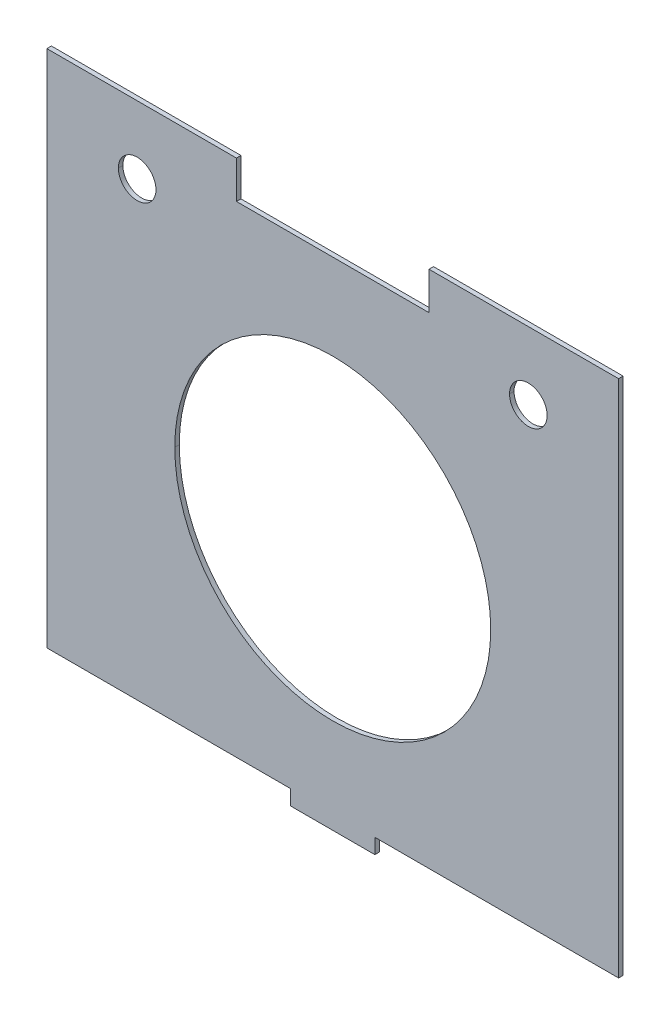
ISO-10303-21;
HEADER;
FILE_DESCRIPTION(('STEP AP214'),'2;1');
FILE_NAME('part.step','',(''),(''),'','','');
FILE_SCHEMA(('AUTOMOTIVE_DESIGN { 1 0 10303 214 1 1 1 1 }'));
ENDSEC;
DATA;
#1=APPLICATION_CONTEXT('core data for automotive mechanical design processes');
#2=APPLICATION_PROTOCOL_DEFINITION('international standard','automotive_design',2000,#1);
#3=PRODUCT_CONTEXT('',#1,'mechanical');
#4=PRODUCT('Part','Part','',(#3));
#5=PRODUCT_RELATED_PRODUCT_CATEGORY('part','',(#4));
#6=PRODUCT_DEFINITION_FORMATION('','',#4);
#7=PRODUCT_DEFINITION_CONTEXT('part definition',#1,'design');
#8=PRODUCT_DEFINITION('design','',#6,#7);
#9=PRODUCT_DEFINITION_SHAPE('','',#8);
#10=(LENGTH_UNIT() NAMED_UNIT(*) SI_UNIT(.MILLI.,.METRE.));
#11=(NAMED_UNIT(*) PLANE_ANGLE_UNIT() SI_UNIT($,.RADIAN.));
#12=(NAMED_UNIT(*) SI_UNIT($,.STERADIAN.) SOLID_ANGLE_UNIT());
#13=UNCERTAINTY_MEASURE_WITH_UNIT(LENGTH_MEASURE(1.E-05),#10,'distance_accuracy_value','');
#14=(GEOMETRIC_REPRESENTATION_CONTEXT(3) GLOBAL_UNCERTAINTY_ASSIGNED_CONTEXT((#13)) GLOBAL_UNIT_ASSIGNED_CONTEXT((#10,
#11,#12)) REPRESENTATION_CONTEXT('',''));
#15=CARTESIAN_POINT('',(0.,0.,0.));
#16=DIRECTION('',(0.,0.,1.));
#17=DIRECTION('',(1.,0.,0.));
#18=AXIS2_PLACEMENT_3D('',#15,#16,#17);
#19=CARTESIAN_POINT('',(-13.,14.2,0.3));
#20=DIRECTION('',(0.,0.,1.));
#21=DIRECTION('',(-1.,0.,0.));
#22=AXIS2_PLACEMENT_3D('',#19,#20,#21);
#23=CYLINDRICAL_SURFACE('',#22,1.25);
#24=DIRECTION('',(0.,0.,-1.));
#25=VECTOR('',#24,1.);
#26=CARTESIAN_POINT('',(-11.75,14.2,0.3));
#27=LINE('',#26,#25);
#28=CARTESIAN_POINT('',(-11.75,14.2,0.3));
#29=VERTEX_POINT('',#28);
#30=CARTESIAN_POINT('',(-11.75,14.2,0.));
#31=VERTEX_POINT('',#30);
#32=EDGE_CURVE('E11',#29,#31,#27,.T.);
#33=ORIENTED_EDGE('',*,*,#32,.F.);
#34=CARTESIAN_POINT('',(-13.,14.2,0.3));
#35=DIRECTION('',(0.,0.,1.));
#36=DIRECTION('',(1.,0.,0.));
#37=AXIS2_PLACEMENT_3D('',#34,#35,#36);
#38=CIRCLE('',#37,1.25);
#39=CARTESIAN_POINT('',(-14.25,14.2,0.3));
#40=VERTEX_POINT('',#39);
#41=EDGE_CURVE('E262',#29,#40,#38,.T.);
#42=ORIENTED_EDGE('',*,*,#41,.T.);
#43=DIRECTION('',(0.,0.,-1.));
#44=VECTOR('',#43,1.);
#45=CARTESIAN_POINT('',(-14.25,14.2,0.3));
#46=LINE('',#45,#44);
#47=CARTESIAN_POINT('',(-14.25,14.2,0.));
#48=VERTEX_POINT('',#47);
#49=EDGE_CURVE('E20',#40,#48,#46,.T.);
#50=ORIENTED_EDGE('',*,*,#49,.T.);
#51=CARTESIAN_POINT('',(-13.,14.2,0.));
#52=DIRECTION('',(0.,0.,1.));
#53=DIRECTION('',(1.,0.,0.));
#54=AXIS2_PLACEMENT_3D('',#51,#52,#53);
#55=CIRCLE('',#54,1.25);
#56=EDGE_CURVE('E242',#31,#48,#55,.T.);
#57=ORIENTED_EDGE('',*,*,#56,.F.);
#58=EDGE_LOOP('',(#33,#42,#50,#57));
#59=FACE_BOUND('',#58,.T.);
#60=ADVANCED_FACE('F17',(#59),#23,.F.);
#61=CARTESIAN_POINT('',(-13.,14.2,0.3));
#62=DIRECTION('',(0.,0.,1.));
#63=DIRECTION('',(-1.,0.,0.));
#64=AXIS2_PLACEMENT_3D('',#61,#62,#63);
#65=CYLINDRICAL_SURFACE('',#64,1.25);
#66=ORIENTED_EDGE('',*,*,#49,.F.);
#67=CARTESIAN_POINT('',(-13.,14.2,0.3));
#68=DIRECTION('',(0.,0.,1.));
#69=DIRECTION('',(-1.,0.,0.));
#70=AXIS2_PLACEMENT_3D('',#67,#68,#69);
#71=CIRCLE('',#70,1.25);
#72=EDGE_CURVE('E265',#40,#29,#71,.T.);
#73=ORIENTED_EDGE('',*,*,#72,.T.);
#74=ORIENTED_EDGE('',*,*,#32,.T.);
#75=CARTESIAN_POINT('',(-13.,14.2,0.));
#76=DIRECTION('',(0.,0.,1.));
#77=DIRECTION('',(-1.,0.,0.));
#78=AXIS2_PLACEMENT_3D('',#75,#76,#77);
#79=CIRCLE('',#78,1.25);
#80=EDGE_CURVE('E248',#48,#31,#79,.T.);
#81=ORIENTED_EDGE('',*,*,#80,.F.);
#82=EDGE_LOOP('',(#66,#73,#74,#81));
#83=FACE_BOUND('',#82,.T.);
#84=ADVANCED_FACE('F352',(#83),#65,.F.);
#85=CARTESIAN_POINT('',(13.,14.2,0.3));
#86=DIRECTION('',(0.,0.,1.));
#87=DIRECTION('',(-1.,0.,0.));
#88=AXIS2_PLACEMENT_3D('',#85,#86,#87);
#89=CYLINDRICAL_SURFACE('',#88,1.25);
#90=DIRECTION('',(0.,0.,-1.));
#91=VECTOR('',#90,1.);
#92=CARTESIAN_POINT('',(14.25,14.2,0.3));
#93=LINE('',#92,#91);
#94=CARTESIAN_POINT('',(14.25,14.2,0.3));
#95=VERTEX_POINT('',#94);
#96=CARTESIAN_POINT('',(14.25,14.2,0.));
#97=VERTEX_POINT('',#96);
#98=EDGE_CURVE('E343',#95,#97,#93,.T.);
#99=ORIENTED_EDGE('',*,*,#98,.F.);
#100=CARTESIAN_POINT('',(13.,14.2,0.3));
#101=DIRECTION('',(0.,0.,1.));
#102=DIRECTION('',(1.,0.,0.));
#103=AXIS2_PLACEMENT_3D('',#100,#101,#102);
#104=CIRCLE('',#103,1.25);
#105=CARTESIAN_POINT('',(11.75,14.2,0.3));
#106=VERTEX_POINT('',#105);
#107=EDGE_CURVE('E315',#95,#106,#104,.T.);
#108=ORIENTED_EDGE('',*,*,#107,.T.);
#109=DIRECTION('',(0.,0.,-1.));
#110=VECTOR('',#109,1.);
#111=CARTESIAN_POINT('',(11.75,14.2,0.3));
#112=LINE('',#111,#110);
#113=CARTESIAN_POINT('',(11.75,14.2,0.));
#114=VERTEX_POINT('',#113);
#115=EDGE_CURVE('E286',#106,#114,#112,.T.);
#116=ORIENTED_EDGE('',*,*,#115,.T.);
#117=CARTESIAN_POINT('',(13.,14.2,0.));
#118=DIRECTION('',(0.,0.,1.));
#119=DIRECTION('',(1.,0.,0.));
#120=AXIS2_PLACEMENT_3D('',#117,#118,#119);
#121=CIRCLE('',#120,1.25);
#122=EDGE_CURVE('E243',#97,#114,#121,.T.);
#123=ORIENTED_EDGE('',*,*,#122,.F.);
#124=EDGE_LOOP('',(#99,#108,#116,#123));
#125=FACE_BOUND('',#124,.T.);
#126=ADVANCED_FACE('F456',(#125),#89,.F.);
#127=CARTESIAN_POINT('',(13.,14.2,0.3));
#128=DIRECTION('',(0.,0.,1.));
#129=DIRECTION('',(-1.,0.,0.));
#130=AXIS2_PLACEMENT_3D('',#127,#128,#129);
#131=CYLINDRICAL_SURFACE('',#130,1.25);
#132=ORIENTED_EDGE('',*,*,#115,.F.);
#133=CARTESIAN_POINT('',(13.,14.2,0.3));
#134=DIRECTION('',(0.,0.,1.));
#135=DIRECTION('',(-1.,0.,0.));
#136=AXIS2_PLACEMENT_3D('',#133,#134,#135);
#137=CIRCLE('',#136,1.25);
#138=EDGE_CURVE('E266',#106,#95,#137,.T.);
#139=ORIENTED_EDGE('',*,*,#138,.T.);
#140=ORIENTED_EDGE('',*,*,#98,.T.);
#141=CARTESIAN_POINT('',(13.,14.2,0.));
#142=DIRECTION('',(0.,0.,1.));
#143=DIRECTION('',(-1.,0.,0.));
#144=AXIS2_PLACEMENT_3D('',#141,#142,#143);
#145=CIRCLE('',#144,1.25);
#146=EDGE_CURVE('E239',#114,#97,#145,.T.);
#147=ORIENTED_EDGE('',*,*,#146,.F.);
#148=EDGE_LOOP('',(#132,#139,#140,#147));
#149=FACE_BOUND('',#148,.T.);
#150=ADVANCED_FACE('F447',(#149),#131,.F.);
#151=CARTESIAN_POINT('',(6.4,16.2,0.));
#152=DIRECTION('',(0.,1.,0.));
#153=DIRECTION('',(1.,0.,0.));
#154=AXIS2_PLACEMENT_3D('',#151,#152,#153);
#155=PLANE('',#154);
#156=DIRECTION('',(0.,0.,1.));
#157=VECTOR('',#156,1.);
#158=CARTESIAN_POINT('',(-6.4,16.2,0.));
#159=LINE('',#158,#157);
#160=CARTESIAN_POINT('',(-6.4,16.2,0.));
#161=VERTEX_POINT('',#160);
#162=CARTESIAN_POINT('',(-6.4,16.2,0.3));
#163=VERTEX_POINT('',#162);
#164=EDGE_CURVE('E283',#161,#163,#159,.T.);
#165=ORIENTED_EDGE('',*,*,#164,.T.);
#166=DIRECTION('',(-1.,0.,0.));
#167=VECTOR('',#166,1.);
#168=CARTESIAN_POINT('',(6.4,16.2,0.3));
#169=LINE('',#168,#167);
#170=CARTESIAN_POINT('',(6.4,16.2,0.3));
#171=VERTEX_POINT('',#170);
#172=EDGE_CURVE('E269',#171,#163,#169,.T.);
#173=ORIENTED_EDGE('',*,*,#172,.F.);
#174=DIRECTION('',(0.,0.,1.));
#175=VECTOR('',#174,1.);
#176=CARTESIAN_POINT('',(6.4,16.2,0.));
#177=LINE('',#176,#175);
#178=CARTESIAN_POINT('',(6.4,16.2,0.));
#179=VERTEX_POINT('',#178);
#180=EDGE_CURVE('E324',#179,#171,#177,.T.);
#181=ORIENTED_EDGE('',*,*,#180,.F.);
#182=DIRECTION('',(-1.,0.,0.));
#183=VECTOR('',#182,1.);
#184=CARTESIAN_POINT('',(6.4,16.2,0.));
#185=LINE('',#184,#183);
#186=EDGE_CURVE('E224',#179,#161,#185,.T.);
#187=ORIENTED_EDGE('',*,*,#186,.T.);
#188=EDGE_LOOP('',(#165,#173,#181,#187));
#189=FACE_BOUND('',#188,.T.);
#190=ADVANCED_FACE('F445',(#189),#155,.T.);
#191=CARTESIAN_POINT('',(-6.4,16.2,0.));
#192=DIRECTION('',(1.,0.,0.));
#193=DIRECTION('',(0.,1.,0.));
#194=AXIS2_PLACEMENT_3D('',#191,#192,#193);
#195=PLANE('',#194);
#196=DIRECTION('',(0.,0.,1.));
#197=VECTOR('',#196,1.);
#198=CARTESIAN_POINT('',(-6.4,18.7,0.));
#199=LINE('',#198,#197);
#200=CARTESIAN_POINT('',(-6.4,18.7,0.));
#201=VERTEX_POINT('',#200);
#202=CARTESIAN_POINT('',(-6.4,18.7,0.3));
#203=VERTEX_POINT('',#202);
#204=EDGE_CURVE('E287',#201,#203,#199,.T.);
#205=ORIENTED_EDGE('',*,*,#204,.T.);
#206=DIRECTION('',(0.,1.,0.));
#207=VECTOR('',#206,1.);
#208=CARTESIAN_POINT('',(-6.4,16.2,0.3));
#209=LINE('',#208,#207);
#210=EDGE_CURVE('E273',#163,#203,#209,.T.);
#211=ORIENTED_EDGE('',*,*,#210,.F.);
#212=ORIENTED_EDGE('',*,*,#164,.F.);
#213=DIRECTION('',(0.,1.,0.));
#214=VECTOR('',#213,1.);
#215=CARTESIAN_POINT('',(-6.4,16.2,0.));
#216=LINE('',#215,#214);
#217=EDGE_CURVE('E227',#161,#201,#216,.T.);
#218=ORIENTED_EDGE('',*,*,#217,.T.);
#219=EDGE_LOOP('',(#205,#211,#212,#218));
#220=FACE_BOUND('',#219,.T.);
#221=ADVANCED_FACE('F443',(#220),#195,.T.);
#222=CARTESIAN_POINT('',(-6.4,18.7,0.));
#223=DIRECTION('',(0.,1.,0.));
#224=DIRECTION('',(1.,0.,0.));
#225=AXIS2_PLACEMENT_3D('',#222,#223,#224);
#226=PLANE('',#225);
#227=DIRECTION('',(0.,0.,1.));
#228=VECTOR('',#227,1.);
#229=CARTESIAN_POINT('',(-19.,18.7,0.));
#230=LINE('',#229,#228);
#231=CARTESIAN_POINT('',(-19.,18.7,0.));
#232=VERTEX_POINT('',#231);
#233=CARTESIAN_POINT('',(-19.,18.7,0.3));
#234=VERTEX_POINT('',#233);
#235=EDGE_CURVE('E195',#232,#234,#230,.T.);
#236=ORIENTED_EDGE('',*,*,#235,.T.);
#237=DIRECTION('',(-1.,0.,0.));
#238=VECTOR('',#237,1.);
#239=CARTESIAN_POINT('',(-6.4,18.7,0.3));
#240=LINE('',#239,#238);
#241=EDGE_CURVE('E278',#203,#234,#240,.T.);
#242=ORIENTED_EDGE('',*,*,#241,.F.);
#243=ORIENTED_EDGE('',*,*,#204,.F.);
#244=DIRECTION('',(-1.,0.,0.));
#245=VECTOR('',#244,1.);
#246=CARTESIAN_POINT('',(-6.4,18.7,0.));
#247=LINE('',#246,#245);
#248=EDGE_CURVE('E205',#201,#232,#247,.T.);
#249=ORIENTED_EDGE('',*,*,#248,.T.);
#250=EDGE_LOOP('',(#236,#242,#243,#249));
#251=FACE_BOUND('',#250,.T.);
#252=ADVANCED_FACE('F441',(#251),#226,.T.);
#253=CARTESIAN_POINT('',(-19.,18.7,0.));
#254=DIRECTION('',(-1.,0.,0.));
#255=DIRECTION('',(0.,0.,1.));
#256=AXIS2_PLACEMENT_3D('',#253,#254,#255);
#257=PLANE('',#256);
#258=DIRECTION('',(0.,0.,1.));
#259=VECTOR('',#258,1.);
#260=CARTESIAN_POINT('',(-19.,-15.8,0.));
#261=LINE('',#260,#259);
#262=CARTESIAN_POINT('',(-19.,-15.8,0.));
#263=VERTEX_POINT('',#262);
#264=CARTESIAN_POINT('',(-19.,-15.8,0.3));
#265=VERTEX_POINT('',#264);
#266=EDGE_CURVE('E183',#263,#265,#261,.T.);
#267=ORIENTED_EDGE('',*,*,#266,.T.);
#268=DIRECTION('',(0.,-1.,0.));
#269=VECTOR('',#268,1.);
#270=CARTESIAN_POINT('',(-19.,18.7,0.3));
#271=LINE('',#270,#269);
#272=EDGE_CURVE('E282',#234,#265,#271,.T.);
#273=ORIENTED_EDGE('',*,*,#272,.F.);
#274=ORIENTED_EDGE('',*,*,#235,.F.);
#275=DIRECTION('',(0.,-1.,0.));
#276=VECTOR('',#275,1.);
#277=CARTESIAN_POINT('',(-19.,18.7,0.));
#278=LINE('',#277,#276);
#279=EDGE_CURVE('E199',#232,#263,#278,.T.);
#280=ORIENTED_EDGE('',*,*,#279,.T.);
#281=EDGE_LOOP('',(#267,#273,#274,#280));
#282=FACE_BOUND('',#281,.T.);
#283=ADVANCED_FACE('F200',(#282),#257,.T.);
#284=CARTESIAN_POINT('',(-19.,-15.8,0.));
#285=DIRECTION('',(0.,-1.,0.));
#286=DIRECTION('',(0.,0.,-1.));
#287=AXIS2_PLACEMENT_3D('',#284,#285,#286);
#288=PLANE('',#287);
#289=DIRECTION('',(0.,0.,1.));
#290=VECTOR('',#289,1.);
#291=CARTESIAN_POINT('',(-2.8,-15.8,0.));
#292=LINE('',#291,#290);
#293=CARTESIAN_POINT('',(-2.8,-15.8,0.));
#294=VERTEX_POINT('',#293);
#295=CARTESIAN_POINT('',(-2.8,-15.8,0.3));
#296=VERTEX_POINT('',#295);
#297=EDGE_CURVE('E196',#294,#296,#292,.T.);
#298=ORIENTED_EDGE('',*,*,#297,.T.);
#299=DIRECTION('',(1.,0.,0.));
#300=VECTOR('',#299,1.);
#301=CARTESIAN_POINT('',(-19.,-15.8,0.3));
#302=LINE('',#301,#300);
#303=EDGE_CURVE('E190',#265,#296,#302,.T.);
#304=ORIENTED_EDGE('',*,*,#303,.F.);
#305=ORIENTED_EDGE('',*,*,#266,.F.);
#306=DIRECTION('',(1.,0.,0.));
#307=VECTOR('',#306,1.);
#308=CARTESIAN_POINT('',(-19.,-15.8,0.));
#309=LINE('',#308,#307);
#310=EDGE_CURVE('E187',#263,#294,#309,.T.);
#311=ORIENTED_EDGE('',*,*,#310,.T.);
#312=EDGE_LOOP('',(#298,#304,#305,#311));
#313=FACE_BOUND('',#312,.T.);
#314=ADVANCED_FACE('F185',(#313),#288,.T.);
#315=CARTESIAN_POINT('',(-2.8,-15.8,0.));
#316=DIRECTION('',(-1.,0.,0.));
#317=DIRECTION('',(0.,0.,1.));
#318=AXIS2_PLACEMENT_3D('',#315,#316,#317);
#319=PLANE('',#318);
#320=DIRECTION('',(0.,0.,1.));
#321=VECTOR('',#320,1.);
#322=CARTESIAN_POINT('',(-2.8,-16.8,0.));
#323=LINE('',#322,#321);
#324=CARTESIAN_POINT('',(-2.8,-16.8,0.));
#325=VERTEX_POINT('',#324);
#326=CARTESIAN_POINT('',(-2.8,-16.8,0.3));
#327=VERTEX_POINT('',#326);
#328=EDGE_CURVE('E274',#325,#327,#323,.T.);
#329=ORIENTED_EDGE('',*,*,#328,.T.);
#330=DIRECTION('',(0.,-1.,0.));
#331=VECTOR('',#330,1.);
#332=CARTESIAN_POINT('',(-2.8,-15.8,0.3));
#333=LINE('',#332,#331);
#334=EDGE_CURVE('E297',#296,#327,#333,.T.);
#335=ORIENTED_EDGE('',*,*,#334,.F.);
#336=ORIENTED_EDGE('',*,*,#297,.F.);
#337=DIRECTION('',(0.,-1.,0.));
#338=VECTOR('',#337,1.);
#339=CARTESIAN_POINT('',(-2.8,-15.8,0.));
#340=LINE('',#339,#338);
#341=EDGE_CURVE('E211',#294,#325,#340,.T.);
#342=ORIENTED_EDGE('',*,*,#341,.T.);
#343=EDGE_LOOP('',(#329,#335,#336,#342));
#344=FACE_BOUND('',#343,.T.);
#345=ADVANCED_FACE('F437',(#344),#319,.T.);
#346=CARTESIAN_POINT('',(-2.8,-16.8,0.));
#347=DIRECTION('',(0.,-1.,0.));
#348=DIRECTION('',(0.,0.,-1.));
#349=AXIS2_PLACEMENT_3D('',#346,#347,#348);
#350=PLANE('',#349);
#351=DIRECTION('',(0.,0.,1.));
#352=VECTOR('',#351,1.);
#353=CARTESIAN_POINT('',(2.8,-16.8,0.));
#354=LINE('',#353,#352);
#355=CARTESIAN_POINT('',(2.8,-16.8,0.));
#356=VERTEX_POINT('',#355);
#357=CARTESIAN_POINT('',(2.8,-16.8,0.3));
#358=VERTEX_POINT('',#357);
#359=EDGE_CURVE('E277',#356,#358,#354,.T.);
#360=ORIENTED_EDGE('',*,*,#359,.T.);
#361=DIRECTION('',(1.,0.,0.));
#362=VECTOR('',#361,1.);
#363=CARTESIAN_POINT('',(-2.8,-16.8,0.3));
#364=LINE('',#363,#362);
#365=EDGE_CURVE('E298',#327,#358,#364,.T.);
#366=ORIENTED_EDGE('',*,*,#365,.F.);
#367=ORIENTED_EDGE('',*,*,#328,.F.);
#368=DIRECTION('',(1.,0.,0.));
#369=VECTOR('',#368,1.);
#370=CARTESIAN_POINT('',(-2.8,-16.8,0.));
#371=LINE('',#370,#369);
#372=EDGE_CURVE('E218',#325,#356,#371,.T.);
#373=ORIENTED_EDGE('',*,*,#372,.T.);
#374=EDGE_LOOP('',(#360,#366,#367,#373));
#375=FACE_BOUND('',#374,.T.);
#376=ADVANCED_FACE('F434',(#375),#350,.T.);
#377=CARTESIAN_POINT('',(2.8,-16.8,0.));
#378=DIRECTION('',(1.,0.,0.));
#379=DIRECTION('',(0.,1.,0.));
#380=AXIS2_PLACEMENT_3D('',#377,#378,#379);
#381=PLANE('',#380);
#382=DIRECTION('',(0.,0.,1.));
#383=VECTOR('',#382,1.);
#384=CARTESIAN_POINT('',(2.8,-15.8,0.));
#385=LINE('',#384,#383);
#386=CARTESIAN_POINT('',(2.8,-15.8,0.));
#387=VERTEX_POINT('',#386);
#388=CARTESIAN_POINT('',(2.8,-15.8,0.3));
#389=VERTEX_POINT('',#388);
#390=EDGE_CURVE('E291',#387,#389,#385,.T.);
#391=ORIENTED_EDGE('',*,*,#390,.T.);
#392=DIRECTION('',(0.,1.,0.));
#393=VECTOR('',#392,1.);
#394=CARTESIAN_POINT('',(2.8,-16.8,0.3));
#395=LINE('',#394,#393);
#396=EDGE_CURVE('E302',#358,#389,#395,.T.);
#397=ORIENTED_EDGE('',*,*,#396,.F.);
#398=ORIENTED_EDGE('',*,*,#359,.F.);
#399=DIRECTION('',(0.,1.,0.));
#400=VECTOR('',#399,1.);
#401=CARTESIAN_POINT('',(2.8,-16.8,0.));
#402=LINE('',#401,#400);
#403=EDGE_CURVE('E377',#356,#387,#402,.T.);
#404=ORIENTED_EDGE('',*,*,#403,.T.);
#405=EDGE_LOOP('',(#391,#397,#398,#404));
#406=FACE_BOUND('',#405,.T.);
#407=ADVANCED_FACE('F430',(#406),#381,.T.);
#408=CARTESIAN_POINT('',(2.8,-15.8,0.));
#409=DIRECTION('',(0.,-1.,0.));
#410=DIRECTION('',(0.,0.,-1.));
#411=AXIS2_PLACEMENT_3D('',#408,#409,#410);
#412=PLANE('',#411);
#413=DIRECTION('',(0.,0.,1.));
#414=VECTOR('',#413,1.);
#415=CARTESIAN_POINT('',(19.,-15.8,0.));
#416=LINE('',#415,#414);
#417=CARTESIAN_POINT('',(19.,-15.8,0.));
#418=VERTEX_POINT('',#417);
#419=CARTESIAN_POINT('',(19.,-15.8,0.3));
#420=VERTEX_POINT('',#419);
#421=EDGE_CURVE('E288',#418,#420,#416,.T.);
#422=ORIENTED_EDGE('',*,*,#421,.T.);
#423=DIRECTION('',(1.,0.,0.));
#424=VECTOR('',#423,1.);
#425=CARTESIAN_POINT('',(2.8,-15.8,0.3));
#426=LINE('',#425,#424);
#427=EDGE_CURVE('E306',#389,#420,#426,.T.);
#428=ORIENTED_EDGE('',*,*,#427,.F.);
#429=ORIENTED_EDGE('',*,*,#390,.F.);
#430=DIRECTION('',(1.,0.,0.));
#431=VECTOR('',#430,1.);
#432=CARTESIAN_POINT('',(2.8,-15.8,0.));
#433=LINE('',#432,#431);
#434=EDGE_CURVE('E387',#387,#418,#433,.T.);
#435=ORIENTED_EDGE('',*,*,#434,.T.);
#436=EDGE_LOOP('',(#422,#428,#429,#435));
#437=FACE_BOUND('',#436,.T.);
#438=ADVANCED_FACE('F427',(#437),#412,.T.);
#439=CARTESIAN_POINT('',(19.,-15.8,0.));
#440=DIRECTION('',(1.,0.,0.));
#441=DIRECTION('',(0.,1.,0.));
#442=AXIS2_PLACEMENT_3D('',#439,#440,#441);
#443=PLANE('',#442);
#444=DIRECTION('',(0.,0.,1.));
#445=VECTOR('',#444,1.);
#446=CARTESIAN_POINT('',(19.,18.7,0.));
#447=LINE('',#446,#445);
#448=CARTESIAN_POINT('',(19.,18.7,0.));
#449=VERTEX_POINT('',#448);
#450=CARTESIAN_POINT('',(19.,18.7,0.3));
#451=VERTEX_POINT('',#450);
#452=EDGE_CURVE('E292',#449,#451,#447,.T.);
#453=ORIENTED_EDGE('',*,*,#452,.T.);
#454=DIRECTION('',(0.,1.,0.));
#455=VECTOR('',#454,1.);
#456=CARTESIAN_POINT('',(19.,-15.8,0.3));
#457=LINE('',#456,#455);
#458=EDGE_CURVE('E307',#420,#451,#457,.T.);
#459=ORIENTED_EDGE('',*,*,#458,.F.);
#460=ORIENTED_EDGE('',*,*,#421,.F.);
#461=DIRECTION('',(0.,1.,0.));
#462=VECTOR('',#461,1.);
#463=CARTESIAN_POINT('',(19.,-15.8,0.));
#464=LINE('',#463,#462);
#465=EDGE_CURVE('E396',#418,#449,#464,.T.);
#466=ORIENTED_EDGE('',*,*,#465,.T.);
#467=EDGE_LOOP('',(#453,#459,#460,#466));
#468=FACE_BOUND('',#467,.T.);
#469=ADVANCED_FACE('F425',(#468),#443,.T.);
#470=CARTESIAN_POINT('',(19.,18.7,0.));
#471=DIRECTION('',(0.,1.,0.));
#472=DIRECTION('',(1.,0.,0.));
#473=AXIS2_PLACEMENT_3D('',#470,#471,#472);
#474=PLANE('',#473);
#475=DIRECTION('',(0.,0.,1.));
#476=VECTOR('',#475,1.);
#477=CARTESIAN_POINT('',(6.4,18.7,0.));
#478=LINE('',#477,#476);
#479=CARTESIAN_POINT('',(6.4,18.7,0.));
#480=VERTEX_POINT('',#479);
#481=CARTESIAN_POINT('',(6.4,18.7,0.3));
#482=VERTEX_POINT('',#481);
#483=EDGE_CURVE('E327',#480,#482,#478,.T.);
#484=ORIENTED_EDGE('',*,*,#483,.T.);
#485=DIRECTION('',(-1.,0.,0.));
#486=VECTOR('',#485,1.);
#487=CARTESIAN_POINT('',(19.,18.7,0.3));
#488=LINE('',#487,#486);
#489=EDGE_CURVE('E311',#451,#482,#488,.T.);
#490=ORIENTED_EDGE('',*,*,#489,.F.);
#491=ORIENTED_EDGE('',*,*,#452,.F.);
#492=DIRECTION('',(-1.,0.,0.));
#493=VECTOR('',#492,1.);
#494=CARTESIAN_POINT('',(19.,18.7,0.));
#495=LINE('',#494,#493);
#496=EDGE_CURVE('E403',#449,#480,#495,.T.);
#497=ORIENTED_EDGE('',*,*,#496,.T.);
#498=EDGE_LOOP('',(#484,#490,#491,#497));
#499=FACE_BOUND('',#498,.T.);
#500=ADVANCED_FACE('F408',(#499),#474,.T.);
#501=CARTESIAN_POINT('',(6.4,18.7,0.));
#502=DIRECTION('',(-1.,0.,0.));
#503=DIRECTION('',(0.,0.,1.));
#504=AXIS2_PLACEMENT_3D('',#501,#502,#503);
#505=PLANE('',#504);
#506=ORIENTED_EDGE('',*,*,#180,.T.);
#507=DIRECTION('',(0.,-1.,0.));
#508=VECTOR('',#507,1.);
#509=CARTESIAN_POINT('',(6.4,18.7,0.3));
#510=LINE('',#509,#508);
#511=EDGE_CURVE('E222',#482,#171,#510,.T.);
#512=ORIENTED_EDGE('',*,*,#511,.F.);
#513=ORIENTED_EDGE('',*,*,#483,.F.);
#514=DIRECTION('',(0.,-1.,0.));
#515=VECTOR('',#514,1.);
#516=CARTESIAN_POINT('',(6.4,18.7,0.));
#517=LINE('',#516,#515);
#518=EDGE_CURVE('E226',#480,#179,#517,.T.);
#519=ORIENTED_EDGE('',*,*,#518,.T.);
#520=EDGE_LOOP('',(#506,#512,#513,#519));
#521=FACE_BOUND('',#520,.T.);
#522=ADVANCED_FACE('F417',(#521),#505,.T.);
#523=CARTESIAN_POINT('',(0.,0.,0.3));
#524=DIRECTION('',(0.,0.,1.));
#525=DIRECTION('',(1.,0.,0.));
#526=AXIS2_PLACEMENT_3D('',#523,#524,#525);
#527=PLANE('',#526);
#528=ORIENTED_EDGE('',*,*,#41,.F.);
#529=ORIENTED_EDGE('',*,*,#72,.F.);
#530=EDGE_LOOP('',(#528,#529));
#531=FACE_BOUND('',#530,.T.);
#532=ORIENTED_EDGE('',*,*,#107,.F.);
#533=ORIENTED_EDGE('',*,*,#138,.F.);
#534=EDGE_LOOP('',(#532,#533));
#535=FACE_BOUND('',#534,.T.);
#536=CARTESIAN_POINT('',(0.,0.,0.3));
#537=DIRECTION('',(0.,0.,-1.));
#538=DIRECTION('',(1.,0.,0.));
#539=AXIS2_PLACEMENT_3D('',#536,#537,#538);
#540=CIRCLE('',#539,10.5);
#541=CARTESIAN_POINT('',(10.5,0.,0.3));
#542=VERTEX_POINT('',#541);
#543=CARTESIAN_POINT('',(-10.5,0.,0.3));
#544=VERTEX_POINT('',#543);
#545=EDGE_CURVE('E261',#542,#544,#540,.T.);
#546=ORIENTED_EDGE('',*,*,#545,.T.);
#547=CARTESIAN_POINT('',(0.,0.,0.3));
#548=DIRECTION('',(0.,0.,-1.));
#549=DIRECTION('',(-1.,0.,0.));
#550=AXIS2_PLACEMENT_3D('',#547,#548,#549);
#551=CIRCLE('',#550,10.5);
#552=EDGE_CURVE('E256',#544,#542,#551,.T.);
#553=ORIENTED_EDGE('',*,*,#552,.T.);
#554=EDGE_LOOP('',(#546,#553));
#555=FACE_BOUND('',#554,.T.);
#556=ORIENTED_EDGE('',*,*,#172,.T.);
#557=ORIENTED_EDGE('',*,*,#210,.T.);
#558=ORIENTED_EDGE('',*,*,#241,.T.);
#559=ORIENTED_EDGE('',*,*,#272,.T.);
#560=ORIENTED_EDGE('',*,*,#303,.T.);
#561=ORIENTED_EDGE('',*,*,#334,.T.);
#562=ORIENTED_EDGE('',*,*,#365,.T.);
#563=ORIENTED_EDGE('',*,*,#396,.T.);
#564=ORIENTED_EDGE('',*,*,#427,.T.);
#565=ORIENTED_EDGE('',*,*,#458,.T.);
#566=ORIENTED_EDGE('',*,*,#489,.T.);
#567=ORIENTED_EDGE('',*,*,#511,.T.);
#568=EDGE_LOOP('',(#556,#557,#558,#559,#560,#561,#562,#563,#564,#565,#566,#567));
#569=FACE_BOUND('',#568,.T.);
#570=ADVANCED_FACE('F421',(#531,#535,#555,#569),#527,.T.);
#571=CARTESIAN_POINT('',(0.,0.,0.));
#572=DIRECTION('',(0.,0.,1.));
#573=DIRECTION('',(-1.,0.,0.));
#574=AXIS2_PLACEMENT_3D('',#571,#572,#573);
#575=CYLINDRICAL_SURFACE('',#574,10.5);
#576=DIRECTION('',(0.,0.,1.));
#577=VECTOR('',#576,1.);
#578=CARTESIAN_POINT('',(-10.5,0.,0.));
#579=LINE('',#578,#577);
#580=CARTESIAN_POINT('',(-10.5,0.,0.));
#581=VERTEX_POINT('',#580);
#582=EDGE_CURVE('E257',#581,#544,#579,.T.);
#583=ORIENTED_EDGE('',*,*,#582,.T.);
#584=ORIENTED_EDGE('',*,*,#545,.F.);
#585=DIRECTION('',(0.,0.,1.));
#586=VECTOR('',#585,1.);
#587=CARTESIAN_POINT('',(10.5,0.,0.));
#588=LINE('',#587,#586);
#589=CARTESIAN_POINT('',(10.5,0.,0.));
#590=VERTEX_POINT('',#589);
#591=EDGE_CURVE('E252',#590,#542,#588,.T.);
#592=ORIENTED_EDGE('',*,*,#591,.F.);
#593=CARTESIAN_POINT('',(0.,0.,0.));
#594=DIRECTION('',(0.,0.,-1.));
#595=DIRECTION('',(1.,0.,0.));
#596=AXIS2_PLACEMENT_3D('',#593,#594,#595);
#597=CIRCLE('',#596,10.5);
#598=EDGE_CURVE('E234',#590,#581,#597,.T.);
#599=ORIENTED_EDGE('',*,*,#598,.T.);
#600=EDGE_LOOP('',(#583,#584,#592,#599));
#601=FACE_BOUND('',#600,.T.);
#602=ADVANCED_FACE('F365',(#601),#575,.F.);
#603=CARTESIAN_POINT('',(0.,0.,0.));
#604=DIRECTION('',(0.,0.,1.));
#605=DIRECTION('',(-1.,0.,0.));
#606=AXIS2_PLACEMENT_3D('',#603,#604,#605);
#607=CYLINDRICAL_SURFACE('',#606,10.5);
#608=ORIENTED_EDGE('',*,*,#591,.T.);
#609=ORIENTED_EDGE('',*,*,#552,.F.);
#610=ORIENTED_EDGE('',*,*,#582,.F.);
#611=CARTESIAN_POINT('',(0.,0.,0.));
#612=DIRECTION('',(0.,0.,-1.));
#613=DIRECTION('',(-1.,0.,0.));
#614=AXIS2_PLACEMENT_3D('',#611,#612,#613);
#615=CIRCLE('',#614,10.5);
#616=EDGE_CURVE('E238',#581,#590,#615,.T.);
#617=ORIENTED_EDGE('',*,*,#616,.T.);
#618=EDGE_LOOP('',(#608,#609,#610,#617));
#619=FACE_BOUND('',#618,.T.);
#620=ADVANCED_FACE('F356',(#619),#607,.F.);
#621=CARTESIAN_POINT('',(0.,0.,0.));
#622=DIRECTION('',(0.,0.,1.));
#623=DIRECTION('',(1.,0.,0.));
#624=AXIS2_PLACEMENT_3D('',#621,#622,#623);
#625=PLANE('',#624);
#626=ORIENTED_EDGE('',*,*,#56,.T.);
#627=ORIENTED_EDGE('',*,*,#80,.T.);
#628=EDGE_LOOP('',(#626,#627));
#629=FACE_BOUND('',#628,.T.);
#630=ORIENTED_EDGE('',*,*,#122,.T.);
#631=ORIENTED_EDGE('',*,*,#146,.T.);
#632=EDGE_LOOP('',(#630,#631));
#633=FACE_BOUND('',#632,.T.);
#634=ORIENTED_EDGE('',*,*,#598,.F.);
#635=ORIENTED_EDGE('',*,*,#616,.F.);
#636=EDGE_LOOP('',(#634,#635));
#637=FACE_BOUND('',#636,.T.);
#638=ORIENTED_EDGE('',*,*,#496,.F.);
#639=ORIENTED_EDGE('',*,*,#465,.F.);
#640=ORIENTED_EDGE('',*,*,#434,.F.);
#641=ORIENTED_EDGE('',*,*,#403,.F.);
#642=ORIENTED_EDGE('',*,*,#372,.F.);
#643=ORIENTED_EDGE('',*,*,#341,.F.);
#644=ORIENTED_EDGE('',*,*,#310,.F.);
#645=ORIENTED_EDGE('',*,*,#279,.F.);
#646=ORIENTED_EDGE('',*,*,#248,.F.);
#647=ORIENTED_EDGE('',*,*,#217,.F.);
#648=ORIENTED_EDGE('',*,*,#186,.F.);
#649=ORIENTED_EDGE('',*,*,#518,.F.);
#650=EDGE_LOOP('',(#638,#639,#640,#641,#642,#643,#644,#645,#646,#647,#648,#649));
#651=FACE_BOUND('',#650,.T.);
#652=ADVANCED_FACE('F208',(#629,#633,#637,#651),#625,.F.);
#653=CLOSED_SHELL('',(#60,#84,#126,#150,#190,#221,#252,#283,#314,#345,#376,#407,#438,#469,#500,
#522,#570,#602,#620,#652));
#654=MANIFOLD_SOLID_BREP('B1',#653);
#655=ADVANCED_BREP_SHAPE_REPRESENTATION('',(#18,#654),#14);
#656=SHAPE_DEFINITION_REPRESENTATION(#9,#655);
ENDSEC;
END-ISO-10303-21;
